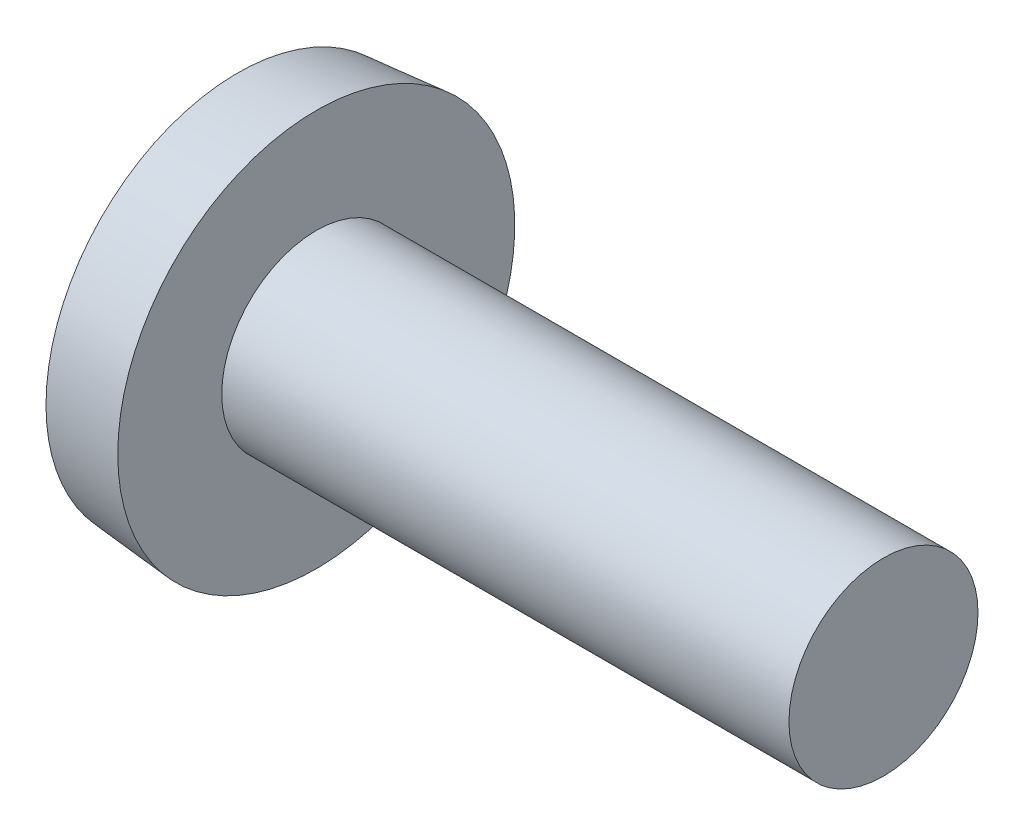
ISO-10303-21;
HEADER;
FILE_DESCRIPTION(('STEP AP214'),'2;1');
FILE_NAME('part.step','',(''),(''),'','','');
FILE_SCHEMA(('AUTOMOTIVE_DESIGN { 1 0 10303 214 1 1 1 1 }'));
ENDSEC;
DATA;
#1=APPLICATION_CONTEXT('core data for automotive mechanical design processes');
#2=APPLICATION_PROTOCOL_DEFINITION('international standard','automotive_design',2000,#1);
#3=PRODUCT_CONTEXT('',#1,'mechanical');
#4=PRODUCT('Part','Part','',(#3));
#5=PRODUCT_RELATED_PRODUCT_CATEGORY('part','',(#4));
#6=PRODUCT_DEFINITION_FORMATION('','',#4);
#7=PRODUCT_DEFINITION_CONTEXT('part definition',#1,'design');
#8=PRODUCT_DEFINITION('design','',#6,#7);
#9=PRODUCT_DEFINITION_SHAPE('','',#8);
#10=(LENGTH_UNIT() NAMED_UNIT(*) SI_UNIT(.MILLI.,.METRE.));
#11=(NAMED_UNIT(*) PLANE_ANGLE_UNIT() SI_UNIT($,.RADIAN.));
#12=(NAMED_UNIT(*) SI_UNIT($,.STERADIAN.) SOLID_ANGLE_UNIT());
#13=UNCERTAINTY_MEASURE_WITH_UNIT(LENGTH_MEASURE(1.E-05),#10,'distance_accuracy_value','');
#14=(GEOMETRIC_REPRESENTATION_CONTEXT(3) GLOBAL_UNCERTAINTY_ASSIGNED_CONTEXT((#13)) GLOBAL_UNIT_ASSIGNED_CONTEXT((#10,
#11,#12)) REPRESENTATION_CONTEXT('',''));
#15=CARTESIAN_POINT('',(0.,0.,0.));
#16=DIRECTION('',(0.,0.,1.));
#17=DIRECTION('',(1.,0.,0.));
#18=AXIS2_PLACEMENT_3D('',#15,#16,#17);
#19=CARTESIAN_POINT('',(14.1434606629998,0.,0.));
#20=DIRECTION('',(-1.,0.,0.));
#21=DIRECTION('',(0.,-1.,0.));
#22=AXIS2_PLACEMENT_3D('',#19,#20,#21);
#23=SPHERICAL_SURFACE('',#22,14.1434606629998);
#24=CARTESIAN_POINT('',(1.5494,0.,0.));
#25=DIRECTION('',(-1.,0.,0.));
#26=DIRECTION('',(0.,0.,1.));
#27=AXIS2_PLACEMENT_3D('',#24,#25,#26);
#28=CIRCLE('',#27,6.4363899464299);
#29=CARTESIAN_POINT('',(1.5494,0.,6.4363899464299));
#30=VERTEX_POINT('',#29);
#31=EDGE_CURVE('E157',#30,#30,#28,.T.);
#32=ORIENTED_EDGE('',*,*,#31,.T.);
#33=EDGE_LOOP('',(#32));
#34=FACE_BOUND('',#33,.T.);
#35=CARTESIAN_POINT('',(14.1147471467109,0.,-0.364028986171051));
#36=DIRECTION('',(-0.0786327745079478,0.,-0.996903649693982));
#37=DIRECTION('',(-0.996903649693982,0.,0.0786327745079478));
#38=AXIS2_PLACEMENT_3D('',#35,#36,#37);
#39=CIRCLE('',#38,14.1387459824778);
#40=CARTESIAN_POINT('',(0.526431224025054,3.75673274974464,0.707776681527435));
#41=VERTEX_POINT('',#40);
#42=CARTESIAN_POINT('',(0.0394229716831011,0.746190434051731,0.746190434051734));
#43=VERTEX_POINT('',#42);
#44=EDGE_CURVE('E128',#41,#43,#39,.F.);
#45=ORIENTED_EDGE('',*,*,#44,.T.);
#46=CARTESIAN_POINT('',(14.1147471467109,-0.364028986171051,0.));
#47=DIRECTION('',(-0.0786327745079478,-0.996903649693982,0.));
#48=DIRECTION('',(0.996903649693982,-0.0786327745079478,0.));
#49=AXIS2_PLACEMENT_3D('',#46,#47,#48);
#50=CIRCLE('',#49,14.1387459824778);
#51=CARTESIAN_POINT('',(0.526431224025054,0.707776681527422,3.75673274974464));
#52=VERTEX_POINT('',#51);
#53=EDGE_CURVE('E109',#43,#52,#50,.F.);
#54=ORIENTED_EDGE('',*,*,#53,.T.);
#55=CARTESIAN_POINT('',(10.6559568840321,0.,-4.35501306622354));
#56=DIRECTION('',(0.625076753553703,0.,0.780563291582921));
#57=DIRECTION('',(0.780563291582921,0.,-0.625076753553703));
#58=AXIS2_PLACEMENT_3D('',#55,#56,#57);
#59=CIRCLE('',#58,12.996486375576);
#60=CARTESIAN_POINT('',(0.526431224025054,-0.707776681527449,3.75673274974464));
#61=VERTEX_POINT('',#60);
#62=EDGE_CURVE('E120',#61,#52,#59,.F.);
#63=ORIENTED_EDGE('',*,*,#62,.F.);
#64=CARTESIAN_POINT('',(14.1147471467109,0.364028986171051,0.));
#65=DIRECTION('',(-0.0786327745079478,0.996903649693982,0.));
#66=DIRECTION('',(-0.996903649693982,-0.0786327745079478,0.));
#67=AXIS2_PLACEMENT_3D('',#64,#65,#66);
#68=CIRCLE('',#67,14.1387459824778);
#69=CARTESIAN_POINT('',(0.0394229716831011,-0.746190434051737,0.746190434051734));
#70=VERTEX_POINT('',#69);
#71=EDGE_CURVE('E195',#61,#70,#68,.F.);
#72=ORIENTED_EDGE('',*,*,#71,.T.);
#73=CARTESIAN_POINT('',(0.526431224025056,-3.75673274974464,0.707776681527436));
#74=VERTEX_POINT('',#73);
#75=EDGE_CURVE('E165',#70,#74,#39,.F.);
#76=ORIENTED_EDGE('',*,*,#75,.T.);
#77=CARTESIAN_POINT('',(10.6559568840321,4.35501306622354,0.));
#78=DIRECTION('',(0.625076753553703,-0.780563291582921,0.));
#79=DIRECTION('',(0.780563291582921,0.625076753553703,0.));
#80=AXIS2_PLACEMENT_3D('',#77,#78,#79);
#81=CIRCLE('',#80,12.996486375576);
#82=CARTESIAN_POINT('',(0.526431224025056,-3.75673274974464,-0.707776681527436));
#83=VERTEX_POINT('',#82);
#84=EDGE_CURVE('E163',#83,#74,#81,.F.);
#85=ORIENTED_EDGE('',*,*,#84,.F.);
#86=CARTESIAN_POINT('',(14.1147471467109,0.,0.364028986171051));
#87=DIRECTION('',(-0.0786327745079478,0.,0.996903649693982));
#88=DIRECTION('',(0.996903649693982,0.,0.0786327745079478));
#89=AXIS2_PLACEMENT_3D('',#86,#87,#88);
#90=CIRCLE('',#89,14.1387459824778);
#91=CARTESIAN_POINT('',(0.0394229716831011,-0.746190434051731,-0.746190434051734));
#92=VERTEX_POINT('',#91);
#93=EDGE_CURVE('E167',#83,#92,#90,.F.);
#94=ORIENTED_EDGE('',*,*,#93,.T.);
#95=CARTESIAN_POINT('',(0.526431224025056,-0.707776681527422,-3.75673274974465));
#96=VERTEX_POINT('',#95);
#97=EDGE_CURVE('E193',#92,#96,#68,.F.);
#98=ORIENTED_EDGE('',*,*,#97,.T.);
#99=CARTESIAN_POINT('',(10.6559568840321,0.,4.35501306622354));
#100=DIRECTION('',(0.625076753553703,0.,-0.780563291582921));
#101=DIRECTION('',(-0.780563291582921,0.,-0.625076753553703));
#102=AXIS2_PLACEMENT_3D('',#99,#100,#101);
#103=CIRCLE('',#102,12.996486375576);
#104=CARTESIAN_POINT('',(0.526431224025056,0.707776681527449,-3.75673274974464));
#105=VERTEX_POINT('',#104);
#106=EDGE_CURVE('E121',#105,#96,#103,.F.);
#107=ORIENTED_EDGE('',*,*,#106,.F.);
#108=CARTESIAN_POINT('',(0.0394229716831011,0.746190434051737,-0.746190434051734));
#109=VERTEX_POINT('',#108);
#110=EDGE_CURVE('E144',#105,#109,#50,.F.);
#111=ORIENTED_EDGE('',*,*,#110,.T.);
#112=CARTESIAN_POINT('',(0.526431224025054,3.75673274974464,-0.707776681527435));
#113=VERTEX_POINT('',#112);
#114=EDGE_CURVE('E60',#109,#113,#90,.F.);
#115=ORIENTED_EDGE('',*,*,#114,.T.);
#116=CARTESIAN_POINT('',(10.6559568840321,-4.35501306622353,0.));
#117=DIRECTION('',(0.625076753553703,0.780563291582921,0.));
#118=DIRECTION('',(-0.780563291582921,0.625076753553703,0.));
#119=AXIS2_PLACEMENT_3D('',#116,#117,#118);
#120=CIRCLE('',#119,12.996486375576);
#121=EDGE_CURVE('E45',#41,#113,#120,.F.);
#122=ORIENTED_EDGE('',*,*,#121,.F.);
#123=EDGE_LOOP('',(#45,#54,#63,#72,#76,#85,#94,#98,#107,#111,#115,#122));
#124=FACE_BOUND('',#123,.T.);
#125=ADVANCED_FACE('F37',(#34,#124),#23,.T.);
#126=CARTESIAN_POINT('',(5.21764340567613,0.,-0.337747913188648));
#127=DIRECTION('',(-0.0786327745079478,0.,0.996903649693982));
#128=DIRECTION('',(0.996903649693982,0.,0.0786327745079478));
#129=AXIS2_PLACEMENT_3D('',#126,#127,#128);
#130=PLANE('',#129);
#131=ORIENTED_EDGE('',*,*,#114,.F.);
#132=DIRECTION('',(0.99383588456954,-0.0783907983818223,0.078390798381822));
#133=VECTOR('',#132,1.);
#134=CARTESIAN_POINT('',(5.24395653109732,0.33567241265409,-0.335672412654088));
#135=LINE('',#134,#133);
#136=CARTESIAN_POINT('',(4.7498,0.374650000000001,-0.374649999999999));
#137=VERTEX_POINT('',#136);
#138=EDGE_CURVE('E146',#109,#137,#135,.T.);
#139=ORIENTED_EDGE('',*,*,#138,.T.);
#140=DIRECTION('',(0.779088051721572,-0.623895378317141,0.0614521324218886));
#141=VECTOR('',#140,1.);
#142=CARTESIAN_POINT('',(0.,4.1783,-0.7493));
#143=LINE('',#142,#141);
#144=EDGE_CURVE('E130',#113,#137,#143,.T.);
#145=ORIENTED_EDGE('',*,*,#144,.F.);
#146=EDGE_LOOP('',(#131,#139,#145));
#147=FACE_BOUND('',#146,.T.);
#148=ADVANCED_FACE('F171',(#147),#130,.T.);
#149=DIRECTION('',(0.779088051721572,0.623895378317141,0.0614521324218887));
#150=VECTOR('',#149,1.);
#151=CARTESIAN_POINT('',(0.,-4.1783,-0.749300000000001));
#152=LINE('',#151,#150);
#153=CARTESIAN_POINT('',(4.7498,-0.37465,-0.37465));
#154=VERTEX_POINT('',#153);
#155=EDGE_CURVE('E52',#83,#154,#152,.T.);
#156=ORIENTED_EDGE('',*,*,#155,.T.);
#157=DIRECTION('',(-0.99383588456954,-0.0783907983818218,-0.0783907983818221));
#158=VECTOR('',#157,1.);
#159=CARTESIAN_POINT('',(5.24395653109732,-0.335672412654087,-0.335672412654089));
#160=LINE('',#159,#158);
#161=EDGE_CURVE('E191',#154,#92,#160,.T.);
#162=ORIENTED_EDGE('',*,*,#161,.T.);
#163=ORIENTED_EDGE('',*,*,#93,.F.);
#164=EDGE_LOOP('',(#156,#162,#163));
#165=FACE_BOUND('',#164,.T.);
#166=ADVANCED_FACE('F197',(#165),#130,.T.);
#167=CARTESIAN_POINT('',(5.21764340567613,0.,0.337747913188648));
#168=DIRECTION('',(-0.0786327745079478,0.,-0.996903649693982));
#169=DIRECTION('',(-0.996903649693982,0.,0.0786327745079478));
#170=AXIS2_PLACEMENT_3D('',#167,#168,#169);
#171=PLANE('',#170);
#172=DIRECTION('',(0.779088051721572,-0.623895378317141,-0.0614521324218887));
#173=VECTOR('',#172,1.);
#174=CARTESIAN_POINT('',(0.,4.1783,0.7493));
#175=LINE('',#174,#173);
#176=CARTESIAN_POINT('',(4.7498,0.374649999999999,0.374650000000001));
#177=VERTEX_POINT('',#176);
#178=EDGE_CURVE('E125',#41,#177,#175,.T.);
#179=ORIENTED_EDGE('',*,*,#178,.T.);
#180=DIRECTION('',(-0.99383588456954,0.0783907983818218,0.078390798381822));
#181=VECTOR('',#180,1.);
#182=CARTESIAN_POINT('',(5.24395653109732,0.335672412654087,0.335672412654088));
#183=LINE('',#182,#181);
#184=EDGE_CURVE('E11',#177,#43,#183,.T.);
#185=ORIENTED_EDGE('',*,*,#184,.T.);
#186=ORIENTED_EDGE('',*,*,#44,.F.);
#187=EDGE_LOOP('',(#179,#185,#186));
#188=FACE_BOUND('',#187,.T.);
#189=ADVANCED_FACE('F127',(#188),#171,.T.);
#190=ORIENTED_EDGE('',*,*,#75,.F.);
#191=DIRECTION('',(0.99383588456954,0.0783907983818223,-0.078390798381822));
#192=VECTOR('',#191,1.);
#193=CARTESIAN_POINT('',(5.24395653109732,-0.33567241265409,0.335672412654088));
#194=LINE('',#193,#192);
#195=CARTESIAN_POINT('',(4.7498,-0.37465,0.37465));
#196=VERTEX_POINT('',#195);
#197=EDGE_CURVE('E205',#70,#196,#194,.T.);
#198=ORIENTED_EDGE('',*,*,#197,.T.);
#199=DIRECTION('',(0.779088051721572,0.623895378317141,-0.0614521324218887));
#200=VECTOR('',#199,1.);
#201=CARTESIAN_POINT('',(0.,-4.1783,0.7493));
#202=LINE('',#201,#200);
#203=EDGE_CURVE('E176',#74,#196,#202,.T.);
#204=ORIENTED_EDGE('',*,*,#203,.F.);
#205=EDGE_LOOP('',(#190,#198,#204));
#206=FACE_BOUND('',#205,.T.);
#207=ADVANCED_FACE('F204',(#206),#171,.T.);
#208=CARTESIAN_POINT('',(-25.4,0.,0.));
#209=DIRECTION('',(-1.,0.,0.));
#210=DIRECTION('',(0.,0.,1.));
#211=AXIS2_PLACEMENT_3D('',#208,#209,#210);
#212=CYLINDRICAL_SURFACE('',#211,3.175);
#213=CARTESIAN_POINT('',(23.241,0.,0.));
#214=DIRECTION('',(-1.,0.,0.));
#215=DIRECTION('',(0.,0.,1.));
#216=AXIS2_PLACEMENT_3D('',#213,#214,#215);
#217=CIRCLE('',#216,3.175);
#218=CARTESIAN_POINT('',(23.241,0.,3.175));
#219=VERTEX_POINT('',#218);
#220=EDGE_CURVE('E160',#219,#219,#217,.T.);
#221=ORIENTED_EDGE('',*,*,#220,.T.);
#222=EDGE_LOOP('',(#221));
#223=FACE_BOUND('',#222,.T.);
#224=CARTESIAN_POINT('',(4.191,0.,0.));
#225=DIRECTION('',(-1.,0.,0.));
#226=DIRECTION('',(0.,0.,1.));
#227=AXIS2_PLACEMENT_3D('',#224,#225,#226);
#228=CIRCLE('',#227,3.175);
#229=CARTESIAN_POINT('',(4.191,0.,3.175));
#230=VERTEX_POINT('',#229);
#231=EDGE_CURVE('E151',#230,#230,#228,.T.);
#232=ORIENTED_EDGE('',*,*,#231,.F.);
#233=EDGE_LOOP('',(#232));
#234=FACE_BOUND('',#233,.T.);
#235=ADVANCED_FACE('F39',(#223,#234),#212,.T.);
#236=CARTESIAN_POINT('',(23.241,3.175,0.));
#237=DIRECTION('',(1.,0.,0.));
#238=DIRECTION('',(0.,0.,-1.));
#239=AXIS2_PLACEMENT_3D('',#236,#237,#238);
#240=PLANE('',#239);
#241=ORIENTED_EDGE('',*,*,#220,.F.);
#242=EDGE_LOOP('',(#241));
#243=FACE_BOUND('',#242,.T.);
#244=ADVANCED_FACE('F236',(#243),#240,.T.);
#245=CARTESIAN_POINT('',(4.191,0.,0.));
#246=DIRECTION('',(1.,0.,0.));
#247=DIRECTION('',(0.,0.,-1.));
#248=AXIS2_PLACEMENT_3D('',#245,#246,#247);
#249=CONICAL_SURFACE('',#248,6.6675,0.0872664625997225);
#250=ORIENTED_EDGE('',*,*,#31,.F.);
#251=EDGE_LOOP('',(#250));
#252=FACE_BOUND('',#251,.T.);
#253=CARTESIAN_POINT('',(4.191,0.,0.));
#254=DIRECTION('',(-1.,0.,0.));
#255=DIRECTION('',(0.,0.,1.));
#256=AXIS2_PLACEMENT_3D('',#253,#254,#255);
#257=CIRCLE('',#256,6.6675);
#258=CARTESIAN_POINT('',(4.191,0.,6.6675));
#259=VERTEX_POINT('',#258);
#260=EDGE_CURVE('E154',#259,#259,#257,.T.);
#261=ORIENTED_EDGE('',*,*,#260,.T.);
#262=EDGE_LOOP('',(#261));
#263=FACE_BOUND('',#262,.T.);
#264=ADVANCED_FACE('F234',(#252,#263),#249,.T.);
#265=CARTESIAN_POINT('',(4.191,3.175,0.));
#266=DIRECTION('',(-1.,0.,0.));
#267=DIRECTION('',(0.,0.,1.));
#268=AXIS2_PLACEMENT_3D('',#265,#266,#267);
#269=PLANE('',#268);
#270=ORIENTED_EDGE('',*,*,#260,.F.);
#271=EDGE_LOOP('',(#270));
#272=FACE_BOUND('',#271,.T.);
#273=ORIENTED_EDGE('',*,*,#231,.T.);
#274=EDGE_LOOP('',(#273));
#275=FACE_BOUND('',#274,.T.);
#276=ADVANCED_FACE('F243',(#272,#275),#269,.F.);
#277=CARTESIAN_POINT('',(4.7498,0.37465,0.37465));
#278=DIRECTION('',(-1.,0.,0.));
#279=DIRECTION('',(0.,0.,1.));
#280=AXIS2_PLACEMENT_3D('',#277,#278,#279);
#281=PLANE('',#280);
#282=DIRECTION('',(0.,1.,0.));
#283=VECTOR('',#282,1.);
#284=CARTESIAN_POINT('',(4.7498,-0.37465,0.37465));
#285=LINE('',#284,#283);
#286=EDGE_CURVE('E117',#196,#177,#285,.T.);
#287=ORIENTED_EDGE('',*,*,#286,.T.);
#288=DIRECTION('',(0.,0.,-1.));
#289=VECTOR('',#288,1.);
#290=CARTESIAN_POINT('',(4.7498,0.37465,0.37465));
#291=LINE('',#290,#289);
#292=EDGE_CURVE('E134',#177,#137,#291,.T.);
#293=ORIENTED_EDGE('',*,*,#292,.T.);
#294=DIRECTION('',(0.,-1.,0.));
#295=VECTOR('',#294,1.);
#296=CARTESIAN_POINT('',(4.7498,0.37465,-0.37465));
#297=LINE('',#296,#295);
#298=EDGE_CURVE('E139',#137,#154,#297,.T.);
#299=ORIENTED_EDGE('',*,*,#298,.T.);
#300=DIRECTION('',(0.,0.,1.));
#301=VECTOR('',#300,1.);
#302=CARTESIAN_POINT('',(4.7498,-0.37465,-0.37465));
#303=LINE('',#302,#301);
#304=EDGE_CURVE('E143',#154,#196,#303,.T.);
#305=ORIENTED_EDGE('',*,*,#304,.T.);
#306=EDGE_LOOP('',(#287,#293,#299,#305));
#307=FACE_BOUND('',#306,.T.);
#308=ADVANCED_FACE('F142',(#307),#281,.T.);
#309=CARTESIAN_POINT('',(4.7498,0.37465,0.37465));
#310=DIRECTION('',(0.625076753553703,0.780563291582921,0.));
#311=DIRECTION('',(-0.780563291582921,0.625076753553703,0.));
#312=AXIS2_PLACEMENT_3D('',#309,#310,#311);
#313=PLANE('',#312);
#314=ORIENTED_EDGE('',*,*,#121,.T.);
#315=ORIENTED_EDGE('',*,*,#144,.T.);
#316=ORIENTED_EDGE('',*,*,#292,.F.);
#317=ORIENTED_EDGE('',*,*,#178,.F.);
#318=EDGE_LOOP('',(#314,#315,#316,#317));
#319=FACE_BOUND('',#318,.T.);
#320=ADVANCED_FACE('F135',(#319),#313,.F.);
#321=CARTESIAN_POINT('',(4.7498,-0.37465,-0.37465));
#322=DIRECTION('',(0.625076753553703,-0.780563291582921,0.));
#323=DIRECTION('',(0.780563291582921,0.625076753553703,0.));
#324=AXIS2_PLACEMENT_3D('',#321,#322,#323);
#325=PLANE('',#324);
#326=ORIENTED_EDGE('',*,*,#84,.T.);
#327=ORIENTED_EDGE('',*,*,#203,.T.);
#328=ORIENTED_EDGE('',*,*,#304,.F.);
#329=ORIENTED_EDGE('',*,*,#155,.F.);
#330=EDGE_LOOP('',(#326,#327,#328,#329));
#331=FACE_BOUND('',#330,.T.);
#332=ADVANCED_FACE('F199',(#331),#325,.F.);
#333=CARTESIAN_POINT('',(5.21764340567613,0.337747913188648,0.));
#334=DIRECTION('',(-0.0786327745079478,-0.996903649693982,0.));
#335=DIRECTION('',(0.996903649693982,-0.0786327745079478,0.));
#336=AXIS2_PLACEMENT_3D('',#333,#334,#335);
#337=PLANE('',#336);
#338=ORIENTED_EDGE('',*,*,#184,.F.);
#339=DIRECTION('',(0.779088051721572,-0.0614521324218864,-0.623895378317141));
#340=VECTOR('',#339,1.);
#341=CARTESIAN_POINT('',(0.,0.749299999999985,4.1783));
#342=LINE('',#341,#340);
#343=EDGE_CURVE('E107',#52,#177,#342,.T.);
#344=ORIENTED_EDGE('',*,*,#343,.F.);
#345=ORIENTED_EDGE('',*,*,#53,.F.);
#346=EDGE_LOOP('',(#338,#344,#345));
#347=FACE_BOUND('',#346,.T.);
#348=ADVANCED_FACE('F106',(#347),#337,.T.);
#349=CARTESIAN_POINT('',(5.21764340567613,-0.337747913188648,0.));
#350=DIRECTION('',(-0.0786327745079478,0.996903649693982,0.));
#351=DIRECTION('',(-0.996903649693982,-0.0786327745079478,0.));
#352=AXIS2_PLACEMENT_3D('',#349,#350,#351);
#353=PLANE('',#352);
#354=DIRECTION('',(0.779088051721572,0.0614521324218908,-0.623895378317141));
#355=VECTOR('',#354,1.);
#356=CARTESIAN_POINT('',(0.,-0.749300000000015,4.1783));
#357=LINE('',#356,#355);
#358=EDGE_CURVE('E122',#61,#196,#357,.T.);
#359=ORIENTED_EDGE('',*,*,#358,.T.);
#360=ORIENTED_EDGE('',*,*,#197,.F.);
#361=ORIENTED_EDGE('',*,*,#71,.F.);
#362=EDGE_LOOP('',(#359,#360,#361));
#363=FACE_BOUND('',#362,.T.);
#364=ADVANCED_FACE('F212',(#363),#353,.T.);
#365=CARTESIAN_POINT('',(4.7498,-0.374650000000001,0.374649999999999));
#366=DIRECTION('',(0.625076753553703,0.,0.780563291582921));
#367=DIRECTION('',(-0.780563291582921,0.,0.625076753553703));
#368=AXIS2_PLACEMENT_3D('',#365,#366,#367);
#369=PLANE('',#368);
#370=ORIENTED_EDGE('',*,*,#62,.T.);
#371=ORIENTED_EDGE('',*,*,#343,.T.);
#372=ORIENTED_EDGE('',*,*,#286,.F.);
#373=ORIENTED_EDGE('',*,*,#358,.F.);
#374=EDGE_LOOP('',(#370,#371,#372,#373));
#375=FACE_BOUND('',#374,.T.);
#376=ADVANCED_FACE('F114',(#375),#369,.F.);
#377=DIRECTION('',(0.779088051721572,-0.0614521324218909,0.623895378317141));
#378=VECTOR('',#377,1.);
#379=CARTESIAN_POINT('',(0.,0.749300000000015,-4.1783));
#380=LINE('',#379,#378);
#381=EDGE_CURVE('E182',#105,#137,#380,.T.);
#382=ORIENTED_EDGE('',*,*,#381,.T.);
#383=ORIENTED_EDGE('',*,*,#138,.F.);
#384=ORIENTED_EDGE('',*,*,#110,.F.);
#385=EDGE_LOOP('',(#382,#383,#384));
#386=FACE_BOUND('',#385,.T.);
#387=ADVANCED_FACE('F216',(#386),#337,.T.);
#388=ORIENTED_EDGE('',*,*,#161,.F.);
#389=DIRECTION('',(0.779088051721572,0.0614521324218865,0.623895378317141));
#390=VECTOR('',#389,1.);
#391=CARTESIAN_POINT('',(0.,-0.749299999999985,-4.1783));
#392=LINE('',#391,#390);
#393=EDGE_CURVE('E185',#96,#154,#392,.T.);
#394=ORIENTED_EDGE('',*,*,#393,.F.);
#395=ORIENTED_EDGE('',*,*,#97,.F.);
#396=EDGE_LOOP('',(#388,#394,#395));
#397=FACE_BOUND('',#396,.T.);
#398=ADVANCED_FACE('F192',(#397),#353,.T.);
#399=CARTESIAN_POINT('',(4.7498,0.374650000000001,-0.374649999999999));
#400=DIRECTION('',(0.625076753553703,0.,-0.780563291582921));
#401=DIRECTION('',(0.780563291582921,0.,0.625076753553703));
#402=AXIS2_PLACEMENT_3D('',#399,#400,#401);
#403=PLANE('',#402);
#404=ORIENTED_EDGE('',*,*,#106,.T.);
#405=ORIENTED_EDGE('',*,*,#393,.T.);
#406=ORIENTED_EDGE('',*,*,#298,.F.);
#407=ORIENTED_EDGE('',*,*,#381,.F.);
#408=EDGE_LOOP('',(#404,#405,#406,#407));
#409=FACE_BOUND('',#408,.T.);
#410=ADVANCED_FACE('F181',(#409),#403,.F.);
#411=CLOSED_SHELL('',(#125,#148,#166,#189,#207,#235,#244,#264,#276,#308,#320,#332,#348,#364,
#376,#387,#398,#410));
#412=MANIFOLD_SOLID_BREP('B2',#411);
#413=ADVANCED_BREP_SHAPE_REPRESENTATION('',(#18,#412),#14);
#414=SHAPE_DEFINITION_REPRESENTATION(#9,#413);
ENDSEC;
END-ISO-10303-21;
